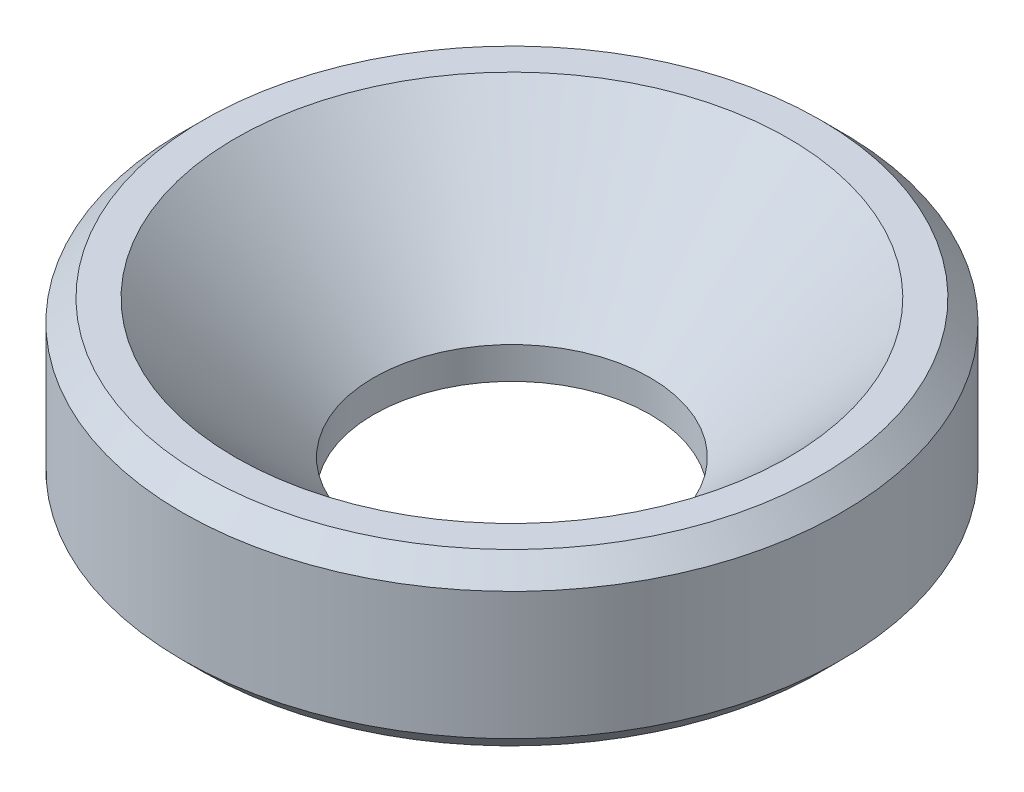
ISO-10303-21;
HEADER;
FILE_DESCRIPTION(('STEP AP214'),'2;1');
FILE_NAME('part.step','',(''),(''),'','','');
FILE_SCHEMA(('AUTOMOTIVE_DESIGN { 1 0 10303 214 1 1 1 1 }'));
ENDSEC;
DATA;
#1=APPLICATION_CONTEXT('core data for automotive mechanical design processes');
#2=APPLICATION_PROTOCOL_DEFINITION('international standard','automotive_design',2000,#1);
#3=PRODUCT_CONTEXT('',#1,'mechanical');
#4=PRODUCT('Part','Part','',(#3));
#5=PRODUCT_RELATED_PRODUCT_CATEGORY('part','',(#4));
#6=PRODUCT_DEFINITION_FORMATION('','',#4);
#7=PRODUCT_DEFINITION_CONTEXT('part definition',#1,'design');
#8=PRODUCT_DEFINITION('design','',#6,#7);
#9=PRODUCT_DEFINITION_SHAPE('','',#8);
#10=(LENGTH_UNIT() NAMED_UNIT(*) SI_UNIT(.MILLI.,.METRE.));
#11=(NAMED_UNIT(*) PLANE_ANGLE_UNIT() SI_UNIT($,.RADIAN.));
#12=(NAMED_UNIT(*) SI_UNIT($,.STERADIAN.) SOLID_ANGLE_UNIT());
#13=UNCERTAINTY_MEASURE_WITH_UNIT(LENGTH_MEASURE(1.E-05),#10,'distance_accuracy_value','');
#14=(GEOMETRIC_REPRESENTATION_CONTEXT(3) GLOBAL_UNCERTAINTY_ASSIGNED_CONTEXT((#13)) GLOBAL_UNIT_ASSIGNED_CONTEXT((#10,
#11,#12)) REPRESENTATION_CONTEXT('',''));
#15=CARTESIAN_POINT('',(0.,0.,0.));
#16=DIRECTION('',(0.,0.,1.));
#17=DIRECTION('',(1.,0.,0.));
#18=AXIS2_PLACEMENT_3D('',#15,#16,#17);
#19=CARTESIAN_POINT('',(0.,4.,0.));
#20=DIRECTION('',(0.,-1.,0.));
#21=DIRECTION('',(0.,0.,-1.));
#22=AXIS2_PLACEMENT_3D('',#19,#20,#21);
#23=CONICAL_SURFACE('',#22,7.25,0.785398163397446);
#24=CARTESIAN_POINT('',(0.,4.,0.));
#25=DIRECTION('',(0.,1.,0.));
#26=DIRECTION('',(0.,0.,1.));
#27=AXIS2_PLACEMENT_3D('',#24,#25,#26);
#28=CIRCLE('',#27,7.25);
#29=CARTESIAN_POINT('',(0.,4.,7.25));
#30=VERTEX_POINT('',#29);
#31=EDGE_CURVE('E70',#30,#30,#28,.T.);
#32=ORIENTED_EDGE('',*,*,#31,.F.);
#33=EDGE_LOOP('',(#32));
#34=FACE_BOUND('',#33,.T.);
#35=CARTESIAN_POINT('',(0.,3.5,0.));
#36=DIRECTION('',(0.,-1.,0.));
#37=DIRECTION('',(0.,0.,1.));
#38=AXIS2_PLACEMENT_3D('',#35,#36,#37);
#39=CIRCLE('',#38,7.75);
#40=CARTESIAN_POINT('',(0.,3.5,7.75));
#41=VERTEX_POINT('',#40);
#42=EDGE_CURVE('E112',#41,#41,#39,.T.);
#43=ORIENTED_EDGE('',*,*,#42,.F.);
#44=EDGE_LOOP('',(#43));
#45=FACE_BOUND('',#44,.T.);
#46=ADVANCED_FACE('F17',(#34,#45),#23,.T.);
#47=CARTESIAN_POINT('',(0.,0.5,0.));
#48=DIRECTION('',(0.,1.,0.));
#49=DIRECTION('',(0.,0.,1.));
#50=AXIS2_PLACEMENT_3D('',#47,#48,#49);
#51=CONICAL_SURFACE('',#50,7.75,0.785398163397449);
#52=CARTESIAN_POINT('',(0.,0.,0.));
#53=DIRECTION('',(0.,-1.,0.));
#54=DIRECTION('',(0.,0.,1.));
#55=AXIS2_PLACEMENT_3D('',#52,#53,#54);
#56=CIRCLE('',#55,7.25);
#57=CARTESIAN_POINT('',(0.,0.,7.25));
#58=VERTEX_POINT('',#57);
#59=EDGE_CURVE('E69',#58,#58,#56,.T.);
#60=ORIENTED_EDGE('',*,*,#59,.F.);
#61=EDGE_LOOP('',(#60));
#62=FACE_BOUND('',#61,.T.);
#63=CARTESIAN_POINT('',(0.,0.5,0.));
#64=DIRECTION('',(0.,1.,0.));
#65=DIRECTION('',(0.,0.,1.));
#66=AXIS2_PLACEMENT_3D('',#63,#64,#65);
#67=CIRCLE('',#66,7.75);
#68=CARTESIAN_POINT('',(0.,0.5,7.75));
#69=VERTEX_POINT('',#68);
#70=EDGE_CURVE('E78',#69,#69,#67,.T.);
#71=ORIENTED_EDGE('',*,*,#70,.F.);
#72=EDGE_LOOP('',(#71));
#73=FACE_BOUND('',#72,.T.);
#74=ADVANCED_FACE('F127',(#62,#73),#51,.T.);
#75=CARTESIAN_POINT('',(0.,4.,0.));
#76=DIRECTION('',(0.,1.,0.));
#77=DIRECTION('',(0.,0.,1.));
#78=AXIS2_PLACEMENT_3D('',#75,#76,#77);
#79=CONICAL_SURFACE('',#78,6.5,0.78539816339745);
#80=CARTESIAN_POINT('',(0.,0.750000000000011,0.));
#81=DIRECTION('',(0.,1.,0.));
#82=DIRECTION('',(0.,0.,1.));
#83=AXIS2_PLACEMENT_3D('',#80,#81,#82);
#84=CIRCLE('',#83,3.25);
#85=CARTESIAN_POINT('',(0.,0.750000000000011,3.25));
#86=VERTEX_POINT('',#85);
#87=EDGE_CURVE('E11',#86,#86,#84,.T.);
#88=ORIENTED_EDGE('',*,*,#87,.F.);
#89=EDGE_LOOP('',(#88));
#90=FACE_BOUND('',#89,.T.);
#91=CARTESIAN_POINT('',(0.,4.,0.));
#92=DIRECTION('',(0.,1.,0.));
#93=DIRECTION('',(0.,0.,1.));
#94=AXIS2_PLACEMENT_3D('',#91,#92,#93);
#95=CIRCLE('',#94,6.5);
#96=CARTESIAN_POINT('',(0.,4.,6.5));
#97=VERTEX_POINT('',#96);
#98=EDGE_CURVE('E65',#97,#97,#95,.T.);
#99=ORIENTED_EDGE('',*,*,#98,.T.);
#100=EDGE_LOOP('',(#99));
#101=FACE_BOUND('',#100,.T.);
#102=ADVANCED_FACE('F66',(#90,#101),#79,.F.);
#103=CARTESIAN_POINT('',(0.,4.,0.));
#104=DIRECTION('',(0.,1.,0.));
#105=DIRECTION('',(0.,0.,1.));
#106=AXIS2_PLACEMENT_3D('',#103,#104,#105);
#107=CYLINDRICAL_SURFACE('',#106,3.25);
#108=CARTESIAN_POINT('',(0.,0.,0.));
#109=DIRECTION('',(0.,1.,0.));
#110=DIRECTION('',(0.,0.,1.));
#111=AXIS2_PLACEMENT_3D('',#108,#109,#110);
#112=CIRCLE('',#111,3.25);
#113=CARTESIAN_POINT('',(0.,0.,3.25));
#114=VERTEX_POINT('',#113);
#115=EDGE_CURVE('E25',#114,#114,#112,.T.);
#116=ORIENTED_EDGE('',*,*,#115,.F.);
#117=EDGE_LOOP('',(#116));
#118=FACE_BOUND('',#117,.T.);
#119=ORIENTED_EDGE('',*,*,#87,.T.);
#120=EDGE_LOOP('',(#119));
#121=FACE_BOUND('',#120,.T.);
#122=ADVANCED_FACE('F148',(#118,#121),#107,.F.);
#123=CARTESIAN_POINT('',(0.,0.,0.));
#124=DIRECTION('',(0.,1.,0.));
#125=DIRECTION('',(1.,0.,0.));
#126=AXIS2_PLACEMENT_3D('',#123,#124,#125);
#127=PLANE('',#126);
#128=ORIENTED_EDGE('',*,*,#115,.T.);
#129=EDGE_LOOP('',(#128));
#130=FACE_BOUND('',#129,.T.);
#131=ORIENTED_EDGE('',*,*,#59,.T.);
#132=EDGE_LOOP('',(#131));
#133=FACE_BOUND('',#132,.T.);
#134=ADVANCED_FACE('F139',(#130,#133),#127,.F.);
#135=CARTESIAN_POINT('',(0.,4.,0.));
#136=DIRECTION('',(0.,1.,0.));
#137=DIRECTION('',(1.,0.,0.));
#138=AXIS2_PLACEMENT_3D('',#135,#136,#137);
#139=PLANE('',#138);
#140=ORIENTED_EDGE('',*,*,#98,.F.);
#141=EDGE_LOOP('',(#140));
#142=FACE_BOUND('',#141,.T.);
#143=ORIENTED_EDGE('',*,*,#31,.T.);
#144=EDGE_LOOP('',(#143));
#145=FACE_BOUND('',#144,.T.);
#146=ADVANCED_FACE('F137',(#142,#145),#139,.T.);
#147=CARTESIAN_POINT('',(0.,4.,0.));
#148=DIRECTION('',(0.,-1.,0.));
#149=DIRECTION('',(0.,0.,-1.));
#150=AXIS2_PLACEMENT_3D('',#147,#148,#149);
#151=CYLINDRICAL_SURFACE('',#150,7.75);
#152=ORIENTED_EDGE('',*,*,#70,.T.);
#153=EDGE_LOOP('',(#152));
#154=FACE_BOUND('',#153,.T.);
#155=ORIENTED_EDGE('',*,*,#42,.T.);
#156=EDGE_LOOP('',(#155));
#157=FACE_BOUND('',#156,.T.);
#158=ADVANCED_FACE('F124',(#154,#157),#151,.T.);
#159=CLOSED_SHELL('',(#46,#74,#102,#122,#134,#146,#158));
#160=MANIFOLD_SOLID_BREP('B1',#159);
#161=ADVANCED_BREP_SHAPE_REPRESENTATION('',(#18,#160),#14);
#162=SHAPE_DEFINITION_REPRESENTATION(#9,#161);
ENDSEC;
END-ISO-10303-21;
